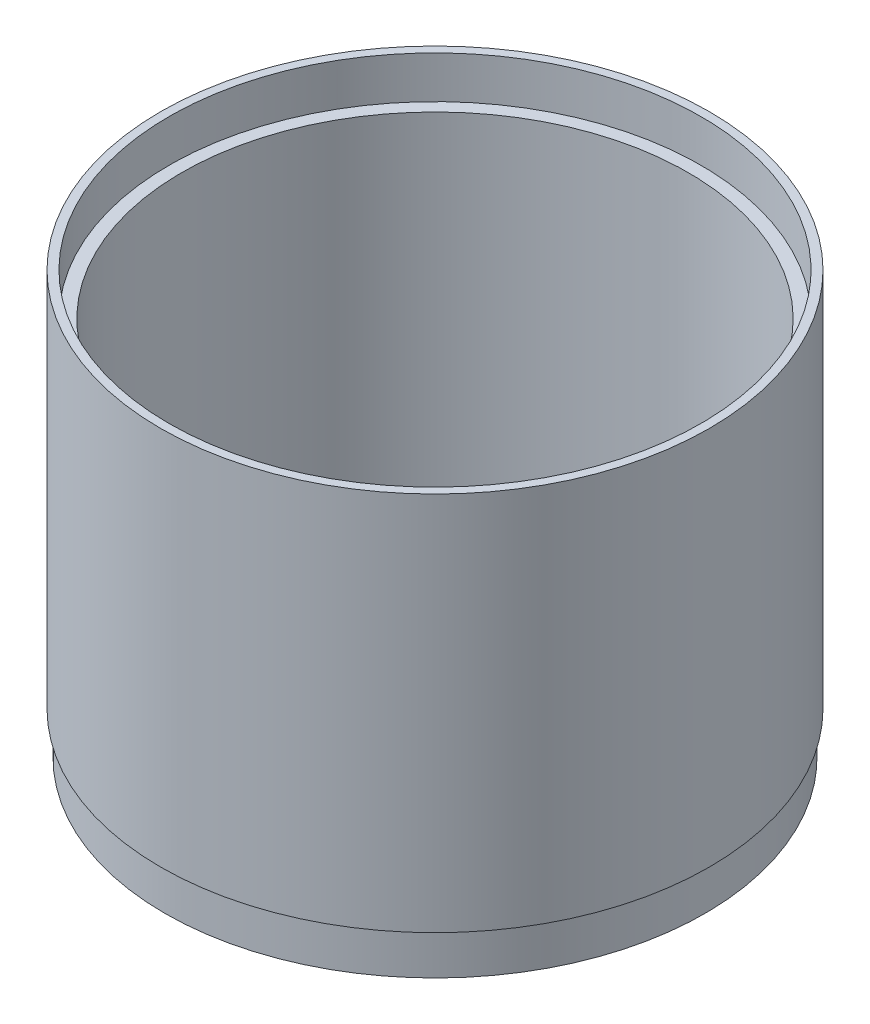
ISO-10303-21;
HEADER;
FILE_DESCRIPTION(('STEP AP214'),'2;1');
FILE_NAME('part.step','',(''),(''),'','','');
FILE_SCHEMA(('AUTOMOTIVE_DESIGN { 1 0 10303 214 1 1 1 1 }'));
ENDSEC;
DATA;
#1=APPLICATION_CONTEXT('core data for automotive mechanical design processes');
#2=APPLICATION_PROTOCOL_DEFINITION('international standard','automotive_design',2000,#1);
#3=PRODUCT_CONTEXT('',#1,'mechanical');
#4=PRODUCT('Part','Part','',(#3));
#5=PRODUCT_RELATED_PRODUCT_CATEGORY('part','',(#4));
#6=PRODUCT_DEFINITION_FORMATION('','',#4);
#7=PRODUCT_DEFINITION_CONTEXT('part definition',#1,'design');
#8=PRODUCT_DEFINITION('design','',#6,#7);
#9=PRODUCT_DEFINITION_SHAPE('','',#8);
#10=(LENGTH_UNIT() NAMED_UNIT(*) SI_UNIT(.MILLI.,.METRE.));
#11=(NAMED_UNIT(*) PLANE_ANGLE_UNIT() SI_UNIT($,.RADIAN.));
#12=(NAMED_UNIT(*) SI_UNIT($,.STERADIAN.) SOLID_ANGLE_UNIT());
#13=UNCERTAINTY_MEASURE_WITH_UNIT(LENGTH_MEASURE(1.E-05),#10,'distance_accuracy_value','');
#14=(GEOMETRIC_REPRESENTATION_CONTEXT(3) GLOBAL_UNCERTAINTY_ASSIGNED_CONTEXT((#13)) GLOBAL_UNIT_ASSIGNED_CONTEXT((#10,
#11,#12)) REPRESENTATION_CONTEXT('',''));
#15=CARTESIAN_POINT('',(0.,0.,0.));
#16=DIRECTION('',(0.,0.,1.));
#17=DIRECTION('',(1.,0.,0.));
#18=AXIS2_PLACEMENT_3D('',#15,#16,#17);
#19=CARTESIAN_POINT('',(0.,100.,0.));
#20=DIRECTION('',(0.,1.,0.));
#21=DIRECTION('',(0.,0.,1.));
#22=AXIS2_PLACEMENT_3D('',#19,#20,#21);
#23=PLANE('',#22);
#24=CARTESIAN_POINT('',(0.,100.,0.));
#25=DIRECTION('',(0.,1.,0.));
#26=DIRECTION('',(0.,0.,1.));
#27=AXIS2_PLACEMENT_3D('',#24,#25,#26);
#28=CIRCLE('',#27,65.);
#29=CARTESIAN_POINT('',(0.,100.,65.));
#30=VERTEX_POINT('',#29);
#31=EDGE_CURVE('E10',#30,#30,#28,.T.);
#32=ORIENTED_EDGE('',*,*,#31,.T.);
#33=EDGE_LOOP('',(#32));
#34=FACE_BOUND('',#33,.T.);
#35=CARTESIAN_POINT('',(0.,100.,0.));
#36=DIRECTION('',(0.,1.,0.));
#37=DIRECTION('',(0.,0.,1.));
#38=AXIS2_PLACEMENT_3D('',#35,#36,#37);
#39=CIRCLE('',#38,63.);
#40=CARTESIAN_POINT('',(0.,100.,63.));
#41=VERTEX_POINT('',#40);
#42=EDGE_CURVE('E67',#41,#41,#39,.T.);
#43=ORIENTED_EDGE('',*,*,#42,.F.);
#44=EDGE_LOOP('',(#43));
#45=FACE_BOUND('',#44,.T.);
#46=ADVANCED_FACE('F39',(#34,#45),#23,.T.);
#47=CARTESIAN_POINT('',(0.,35.5410399424626,0.));
#48=DIRECTION('',(0.,1.,0.));
#49=DIRECTION('',(0.,0.,1.));
#50=AXIS2_PLACEMENT_3D('',#47,#48,#49);
#51=CYLINDRICAL_SURFACE('',#50,65.);
#52=CARTESIAN_POINT('',(0.,10.,0.));
#53=DIRECTION('',(0.,1.,0.));
#54=DIRECTION('',(0.,0.,1.));
#55=AXIS2_PLACEMENT_3D('',#52,#53,#54);
#56=CIRCLE('',#55,65.);
#57=CARTESIAN_POINT('',(0.,10.,65.));
#58=VERTEX_POINT('',#57);
#59=EDGE_CURVE('E45',#58,#58,#56,.T.);
#60=ORIENTED_EDGE('',*,*,#59,.T.);
#61=EDGE_LOOP('',(#60));
#62=FACE_BOUND('',#61,.T.);
#63=ORIENTED_EDGE('',*,*,#31,.F.);
#64=EDGE_LOOP('',(#63));
#65=FACE_BOUND('',#64,.T.);
#66=ADVANCED_FACE('F75',(#62,#65),#51,.T.);
#67=CARTESIAN_POINT('',(0.,10.,0.));
#68=DIRECTION('',(0.,1.,0.));
#69=DIRECTION('',(0.,0.,1.));
#70=AXIS2_PLACEMENT_3D('',#67,#68,#69);
#71=PLANE('',#70);
#72=ORIENTED_EDGE('',*,*,#59,.F.);
#73=EDGE_LOOP('',(#72));
#74=FACE_BOUND('',#73,.T.);
#75=CARTESIAN_POINT('',(0.,10.,0.));
#76=DIRECTION('',(0.,1.,0.));
#77=DIRECTION('',(0.,0.,1.));
#78=AXIS2_PLACEMENT_3D('',#75,#76,#77);
#79=CIRCLE('',#78,64.);
#80=CARTESIAN_POINT('',(0.,10.,64.));
#81=VERTEX_POINT('',#80);
#82=EDGE_CURVE('E49',#81,#81,#79,.T.);
#83=ORIENTED_EDGE('',*,*,#82,.T.);
#84=EDGE_LOOP('',(#83));
#85=FACE_BOUND('',#84,.T.);
#86=ADVANCED_FACE('F79',(#74,#85),#71,.F.);
#87=CARTESIAN_POINT('',(0.,35.5410399424626,0.));
#88=DIRECTION('',(0.,1.,0.));
#89=DIRECTION('',(0.,0.,1.));
#90=AXIS2_PLACEMENT_3D('',#87,#88,#89);
#91=CYLINDRICAL_SURFACE('',#90,64.);
#92=ORIENTED_EDGE('',*,*,#82,.F.);
#93=EDGE_LOOP('',(#92));
#94=FACE_BOUND('',#93,.T.);
#95=CARTESIAN_POINT('',(0.,0.,0.));
#96=DIRECTION('',(0.,1.,0.));
#97=DIRECTION('',(0.,0.,1.));
#98=AXIS2_PLACEMENT_3D('',#95,#96,#97);
#99=CIRCLE('',#98,64.);
#100=CARTESIAN_POINT('',(0.,0.,64.));
#101=VERTEX_POINT('',#100);
#102=EDGE_CURVE('E53',#101,#101,#99,.T.);
#103=ORIENTED_EDGE('',*,*,#102,.T.);
#104=EDGE_LOOP('',(#103));
#105=FACE_BOUND('',#104,.T.);
#106=ADVANCED_FACE('F83',(#94,#105),#91,.T.);
#107=CARTESIAN_POINT('',(0.,0.,0.));
#108=DIRECTION('',(0.,-1.,0.));
#109=DIRECTION('',(0.,0.,-1.));
#110=AXIS2_PLACEMENT_3D('',#107,#108,#109);
#111=PLANE('',#110);
#112=CARTESIAN_POINT('',(0.,0.,0.));
#113=DIRECTION('',(0.,1.,0.));
#114=DIRECTION('',(0.,0.,1.));
#115=AXIS2_PLACEMENT_3D('',#112,#113,#114);
#116=CIRCLE('',#115,60.);
#117=CARTESIAN_POINT('',(0.,0.,60.));
#118=VERTEX_POINT('',#117);
#119=EDGE_CURVE('E58',#118,#118,#116,.T.);
#120=ORIENTED_EDGE('',*,*,#119,.T.);
#121=EDGE_LOOP('',(#120));
#122=FACE_BOUND('',#121,.T.);
#123=ORIENTED_EDGE('',*,*,#102,.F.);
#124=EDGE_LOOP('',(#123));
#125=FACE_BOUND('',#124,.T.);
#126=ADVANCED_FACE('F90',(#122,#125),#111,.T.);
#127=CARTESIAN_POINT('',(0.,35.5410399424626,0.));
#128=DIRECTION('',(0.,1.,0.));
#129=DIRECTION('',(0.,0.,1.));
#130=AXIS2_PLACEMENT_3D('',#127,#128,#129);
#131=CYLINDRICAL_SURFACE('',#130,60.);
#132=CARTESIAN_POINT('',(0.,90.,0.));
#133=DIRECTION('',(0.,1.,0.));
#134=DIRECTION('',(0.,0.,1.));
#135=AXIS2_PLACEMENT_3D('',#132,#133,#134);
#136=CIRCLE('',#135,60.);
#137=CARTESIAN_POINT('',(0.,90.,60.));
#138=VERTEX_POINT('',#137);
#139=EDGE_CURVE('E61',#138,#138,#136,.T.);
#140=ORIENTED_EDGE('',*,*,#139,.T.);
#141=EDGE_LOOP('',(#140));
#142=FACE_BOUND('',#141,.T.);
#143=ORIENTED_EDGE('',*,*,#119,.F.);
#144=EDGE_LOOP('',(#143));
#145=FACE_BOUND('',#144,.T.);
#146=ADVANCED_FACE('F94',(#142,#145),#131,.F.);
#147=CARTESIAN_POINT('',(0.,90.,0.));
#148=DIRECTION('',(0.,1.,0.));
#149=DIRECTION('',(0.,0.,1.));
#150=AXIS2_PLACEMENT_3D('',#147,#148,#149);
#151=PLANE('',#150);
#152=CARTESIAN_POINT('',(0.,90.,0.));
#153=DIRECTION('',(0.,1.,0.));
#154=DIRECTION('',(0.,0.,1.));
#155=AXIS2_PLACEMENT_3D('',#152,#153,#154);
#156=CIRCLE('',#155,63.);
#157=CARTESIAN_POINT('',(0.,90.,63.));
#158=VERTEX_POINT('',#157);
#159=EDGE_CURVE('E64',#158,#158,#156,.T.);
#160=ORIENTED_EDGE('',*,*,#159,.T.);
#161=EDGE_LOOP('',(#160));
#162=FACE_BOUND('',#161,.T.);
#163=ORIENTED_EDGE('',*,*,#139,.F.);
#164=EDGE_LOOP('',(#163));
#165=FACE_BOUND('',#164,.T.);
#166=ADVANCED_FACE('F98',(#162,#165),#151,.T.);
#167=CARTESIAN_POINT('',(0.,35.5410399424626,0.));
#168=DIRECTION('',(0.,1.,0.));
#169=DIRECTION('',(0.,0.,1.));
#170=AXIS2_PLACEMENT_3D('',#167,#168,#169);
#171=CYLINDRICAL_SURFACE('',#170,63.);
#172=ORIENTED_EDGE('',*,*,#42,.T.);
#173=EDGE_LOOP('',(#172));
#174=FACE_BOUND('',#173,.T.);
#175=ORIENTED_EDGE('',*,*,#159,.F.);
#176=EDGE_LOOP('',(#175));
#177=FACE_BOUND('',#176,.T.);
#178=ADVANCED_FACE('F71',(#174,#177),#171,.F.);
#179=CLOSED_SHELL('',(#46,#66,#86,#106,#126,#146,#166,#178));
#180=MANIFOLD_SOLID_BREP('B2',#179);
#181=ADVANCED_BREP_SHAPE_REPRESENTATION('',(#18,#180),#14);
#182=SHAPE_DEFINITION_REPRESENTATION(#9,#181);
ENDSEC;
END-ISO-10303-21;
